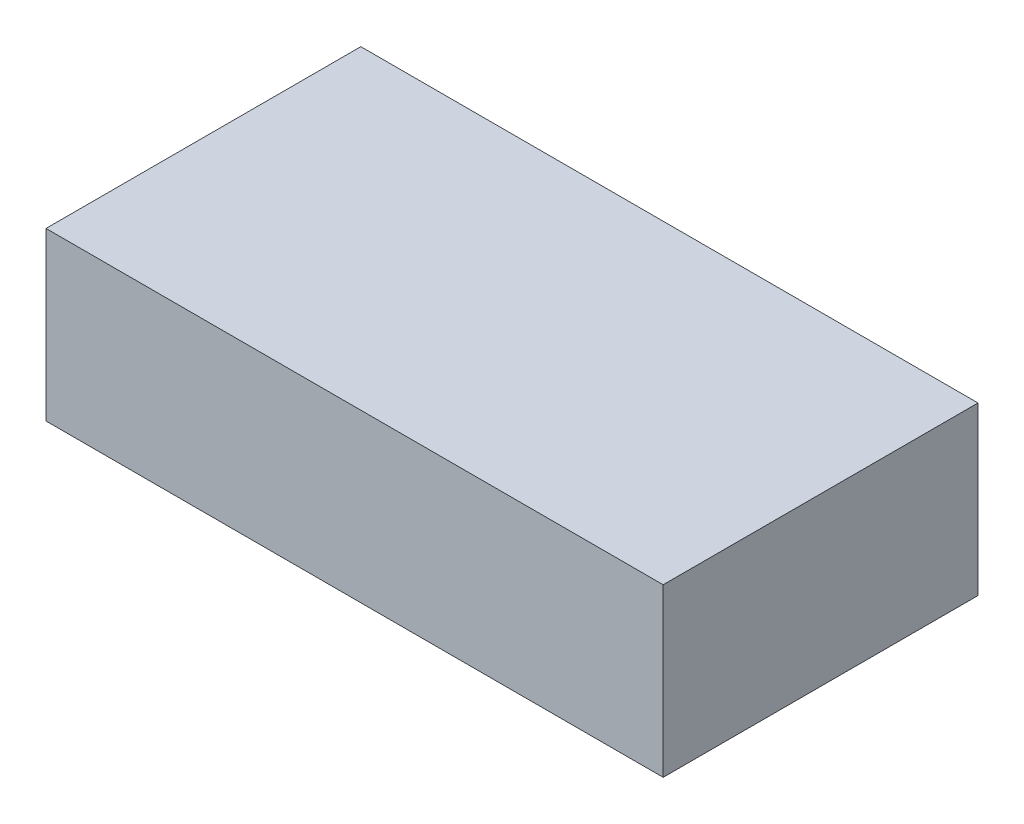
ISO-10303-21;
HEADER;
FILE_DESCRIPTION(('STEP AP214'),'2;1');
FILE_NAME('part.step','',(''),(''),'','','');
FILE_SCHEMA(('AUTOMOTIVE_DESIGN { 1 0 10303 214 1 1 1 1 }'));
ENDSEC;
DATA;
#1=APPLICATION_CONTEXT('core data for automotive mechanical design processes');
#2=APPLICATION_PROTOCOL_DEFINITION('international standard','automotive_design',2000,#1);
#3=PRODUCT_CONTEXT('',#1,'mechanical');
#4=PRODUCT('Part','Part','',(#3));
#5=PRODUCT_RELATED_PRODUCT_CATEGORY('part','',(#4));
#6=PRODUCT_DEFINITION_FORMATION('','',#4);
#7=PRODUCT_DEFINITION_CONTEXT('part definition',#1,'design');
#8=PRODUCT_DEFINITION('design','',#6,#7);
#9=PRODUCT_DEFINITION_SHAPE('','',#8);
#10=(LENGTH_UNIT() NAMED_UNIT(*) SI_UNIT(.MILLI.,.METRE.));
#11=(NAMED_UNIT(*) PLANE_ANGLE_UNIT() SI_UNIT($,.RADIAN.));
#12=(NAMED_UNIT(*) SI_UNIT($,.STERADIAN.) SOLID_ANGLE_UNIT());
#13=UNCERTAINTY_MEASURE_WITH_UNIT(LENGTH_MEASURE(1.E-05),#10,'distance_accuracy_value','');
#14=(GEOMETRIC_REPRESENTATION_CONTEXT(3) GLOBAL_UNCERTAINTY_ASSIGNED_CONTEXT((#13)) GLOBAL_UNIT_ASSIGNED_CONTEXT((#10,
#11,#12)) REPRESENTATION_CONTEXT('',''));
#15=CARTESIAN_POINT('',(0.,0.,0.));
#16=DIRECTION('',(0.,0.,1.));
#17=DIRECTION('',(1.,0.,0.));
#18=AXIS2_PLACEMENT_3D('',#15,#16,#17);
#19=CARTESIAN_POINT('',(-246.666666666667,80.,-110.659409695433));
#20=DIRECTION('',(0.,0.,-1.));
#21=DIRECTION('',(-1.,0.,0.));
#22=AXIS2_PLACEMENT_3D('',#19,#20,#21);
#23=PLANE('',#22);
#24=DIRECTION('',(1.,0.,0.));
#25=VECTOR('',#24,1.);
#26=CARTESIAN_POINT('',(-246.666666666667,0.,-110.659409695433));
#27=LINE('',#26,#25);
#28=CARTESIAN_POINT('',(-246.666666666667,0.,-110.659409695433));
#29=VERTEX_POINT('',#28);
#30=CARTESIAN_POINT('',(49.3333333333334,0.,-110.659409695433));
#31=VERTEX_POINT('',#30);
#32=EDGE_CURVE('E116',#29,#31,#27,.T.);
#33=ORIENTED_EDGE('',*,*,#32,.F.);
#34=DIRECTION('',(0.,-1.,0.));
#35=VECTOR('',#34,1.);
#36=CARTESIAN_POINT('',(-246.666666666667,80.,-110.659409695433));
#37=LINE('',#36,#35);
#38=CARTESIAN_POINT('',(-246.666666666667,80.,-110.659409695433));
#39=VERTEX_POINT('',#38);
#40=EDGE_CURVE('E11',#39,#29,#37,.T.);
#41=ORIENTED_EDGE('',*,*,#40,.F.);
#42=DIRECTION('',(1.,0.,0.));
#43=VECTOR('',#42,1.);
#44=CARTESIAN_POINT('',(-246.666666666667,80.,-110.659409695433));
#45=LINE('',#44,#43);
#46=CARTESIAN_POINT('',(49.3333333333334,80.,-110.659409695433));
#47=VERTEX_POINT('',#46);
#48=EDGE_CURVE('E109',#39,#47,#45,.T.);
#49=ORIENTED_EDGE('',*,*,#48,.T.);
#50=DIRECTION('',(0.,-1.,0.));
#51=VECTOR('',#50,1.);
#52=CARTESIAN_POINT('',(49.3333333333334,80.,-110.659409695433));
#53=LINE('',#52,#51);
#54=EDGE_CURVE('E48',#47,#31,#53,.T.);
#55=ORIENTED_EDGE('',*,*,#54,.T.);
#56=EDGE_LOOP('',(#33,#41,#49,#55));
#57=FACE_BOUND('',#56,.T.);
#58=ADVANCED_FACE('F45',(#57),#23,.T.);
#59=CARTESIAN_POINT('',(-246.666666666667,80.,-110.659409695433));
#60=DIRECTION('',(1.,0.,0.));
#61=DIRECTION('',(0.,0.,-1.));
#62=AXIS2_PLACEMENT_3D('',#59,#60,#61);
#63=PLANE('',#62);
#64=DIRECTION('',(0.,0.,1.));
#65=VECTOR('',#64,1.);
#66=CARTESIAN_POINT('',(-246.666666666667,0.,-110.659409695433));
#67=LINE('',#66,#65);
#68=CARTESIAN_POINT('',(-246.666666666667,0.,40.3405903045673));
#69=VERTEX_POINT('',#68);
#70=EDGE_CURVE('E79',#29,#69,#67,.T.);
#71=ORIENTED_EDGE('',*,*,#70,.T.);
#72=DIRECTION('',(0.,-1.,0.));
#73=VECTOR('',#72,1.);
#74=CARTESIAN_POINT('',(-246.666666666667,80.,40.3405903045673));
#75=LINE('',#74,#73);
#76=CARTESIAN_POINT('',(-246.666666666667,80.,40.3405903045673));
#77=VERTEX_POINT('',#76);
#78=EDGE_CURVE('E55',#77,#69,#75,.T.);
#79=ORIENTED_EDGE('',*,*,#78,.F.);
#80=DIRECTION('',(0.,0.,1.));
#81=VECTOR('',#80,1.);
#82=CARTESIAN_POINT('',(-246.666666666667,80.,-110.659409695433));
#83=LINE('',#82,#81);
#84=EDGE_CURVE('E96',#39,#77,#83,.T.);
#85=ORIENTED_EDGE('',*,*,#84,.F.);
#86=ORIENTED_EDGE('',*,*,#40,.T.);
#87=EDGE_LOOP('',(#71,#79,#85,#86));
#88=FACE_BOUND('',#87,.T.);
#89=ADVANCED_FACE('F132',(#88),#63,.F.);
#90=CARTESIAN_POINT('',(-246.666666666667,80.,40.3405903045673));
#91=DIRECTION('',(0.,0.,-1.));
#92=DIRECTION('',(-1.,0.,0.));
#93=AXIS2_PLACEMENT_3D('',#90,#91,#92);
#94=PLANE('',#93);
#95=DIRECTION('',(1.,0.,0.));
#96=VECTOR('',#95,1.);
#97=CARTESIAN_POINT('',(-246.666666666667,0.,40.3405903045673));
#98=LINE('',#97,#96);
#99=CARTESIAN_POINT('',(49.3333333333334,0.,40.3405903045673));
#100=VERTEX_POINT('',#99);
#101=EDGE_CURVE('E104',#69,#100,#98,.T.);
#102=ORIENTED_EDGE('',*,*,#101,.T.);
#103=DIRECTION('',(0.,-1.,0.));
#104=VECTOR('',#103,1.);
#105=CARTESIAN_POINT('',(49.3333333333334,80.,40.3405903045673));
#106=LINE('',#105,#104);
#107=CARTESIAN_POINT('',(49.3333333333334,80.,40.3405903045673));
#108=VERTEX_POINT('',#107);
#109=EDGE_CURVE('E101',#108,#100,#106,.T.);
#110=ORIENTED_EDGE('',*,*,#109,.F.);
#111=DIRECTION('',(1.,0.,0.));
#112=VECTOR('',#111,1.);
#113=CARTESIAN_POINT('',(-246.666666666667,80.,40.3405903045673));
#114=LINE('',#113,#112);
#115=EDGE_CURVE('E91',#77,#108,#114,.T.);
#116=ORIENTED_EDGE('',*,*,#115,.F.);
#117=ORIENTED_EDGE('',*,*,#78,.T.);
#118=EDGE_LOOP('',(#102,#110,#116,#117));
#119=FACE_BOUND('',#118,.T.);
#120=ADVANCED_FACE('F102',(#119),#94,.F.);
#121=CARTESIAN_POINT('',(49.3333333333334,80.,-110.659409695433));
#122=DIRECTION('',(1.,0.,0.));
#123=DIRECTION('',(0.,0.,-1.));
#124=AXIS2_PLACEMENT_3D('',#121,#122,#123);
#125=PLANE('',#124);
#126=DIRECTION('',(0.,0.,1.));
#127=VECTOR('',#126,1.);
#128=CARTESIAN_POINT('',(49.3333333333334,0.,-110.659409695433));
#129=LINE('',#128,#127);
#130=EDGE_CURVE('E120',#31,#100,#129,.T.);
#131=ORIENTED_EDGE('',*,*,#130,.F.);
#132=ORIENTED_EDGE('',*,*,#54,.F.);
#133=DIRECTION('',(0.,0.,1.));
#134=VECTOR('',#133,1.);
#135=CARTESIAN_POINT('',(49.3333333333334,80.,-110.659409695433));
#136=LINE('',#135,#134);
#137=EDGE_CURVE('E95',#47,#108,#136,.T.);
#138=ORIENTED_EDGE('',*,*,#137,.T.);
#139=ORIENTED_EDGE('',*,*,#109,.T.);
#140=EDGE_LOOP('',(#131,#132,#138,#139));
#141=FACE_BOUND('',#140,.T.);
#142=ADVANCED_FACE('F107',(#141),#125,.T.);
#143=CARTESIAN_POINT('',(0.,80.,0.));
#144=DIRECTION('',(0.,-1.,0.));
#145=DIRECTION('',(0.,0.,-1.));
#146=AXIS2_PLACEMENT_3D('',#143,#144,#145);
#147=PLANE('',#146);
#148=ORIENTED_EDGE('',*,*,#48,.F.);
#149=ORIENTED_EDGE('',*,*,#84,.T.);
#150=ORIENTED_EDGE('',*,*,#115,.T.);
#151=ORIENTED_EDGE('',*,*,#137,.F.);
#152=EDGE_LOOP('',(#148,#149,#150,#151));
#153=FACE_BOUND('',#152,.T.);
#154=ADVANCED_FACE('F94',(#153),#147,.F.);
#155=CARTESIAN_POINT('',(0.,0.,0.));
#156=DIRECTION('',(0.,-1.,0.));
#157=DIRECTION('',(0.,0.,-1.));
#158=AXIS2_PLACEMENT_3D('',#155,#156,#157);
#159=PLANE('',#158);
#160=ORIENTED_EDGE('',*,*,#32,.T.);
#161=ORIENTED_EDGE('',*,*,#130,.T.);
#162=ORIENTED_EDGE('',*,*,#101,.F.);
#163=ORIENTED_EDGE('',*,*,#70,.F.);
#164=EDGE_LOOP('',(#160,#161,#162,#163));
#165=FACE_BOUND('',#164,.T.);
#166=ADVANCED_FACE('F129',(#165),#159,.T.);
#167=CLOSED_SHELL('',(#58,#89,#120,#142,#154,#166));
#168=MANIFOLD_SOLID_BREP('B2',#167);
#169=ADVANCED_BREP_SHAPE_REPRESENTATION('',(#18,#168),#14);
#170=SHAPE_DEFINITION_REPRESENTATION(#9,#169);
ENDSEC;
END-ISO-10303-21;
